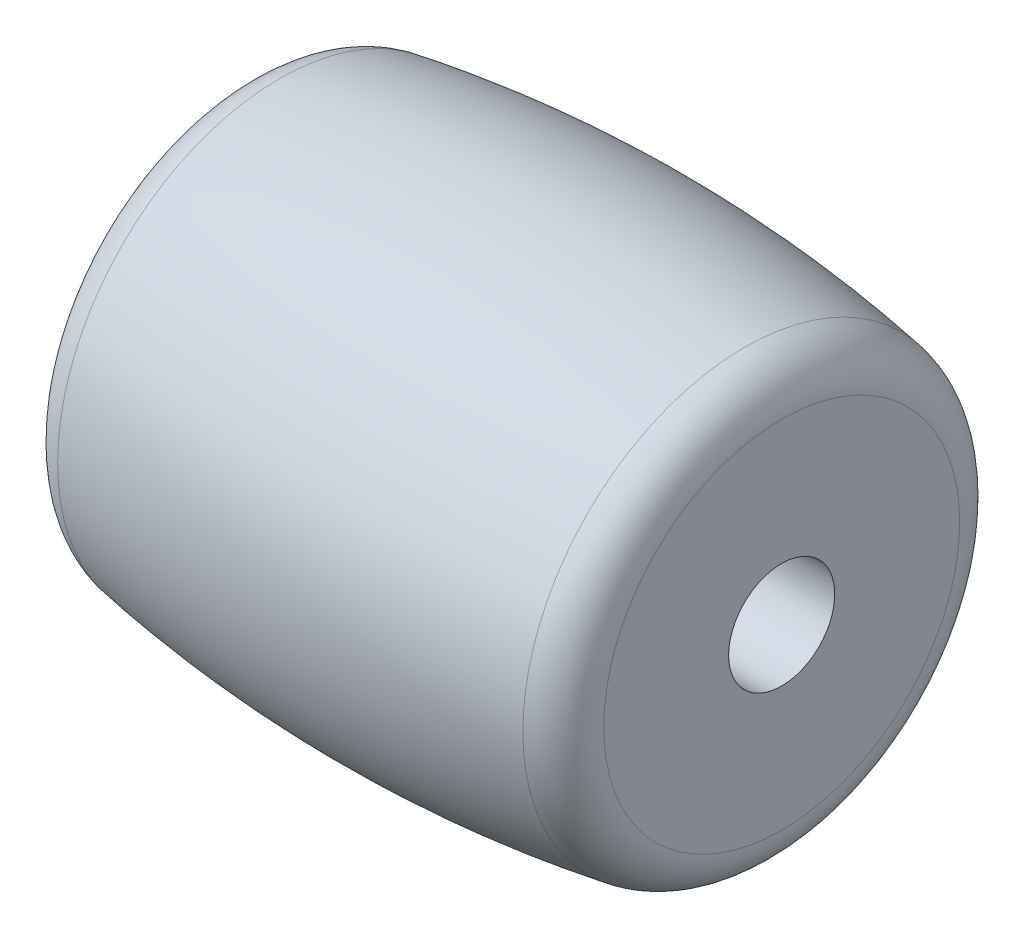
ISO-10303-21;
HEADER;
FILE_DESCRIPTION(('STEP AP214'),'2;1');
FILE_NAME('part.step','',(''),(''),'','','');
FILE_SCHEMA(('AUTOMOTIVE_DESIGN { 1 0 10303 214 1 1 1 1 }'));
ENDSEC;
DATA;
#1=APPLICATION_CONTEXT('core data for automotive mechanical design processes');
#2=APPLICATION_PROTOCOL_DEFINITION('international standard','automotive_design',2000,#1);
#3=PRODUCT_CONTEXT('',#1,'mechanical');
#4=PRODUCT('Part','Part','',(#3));
#5=PRODUCT_RELATED_PRODUCT_CATEGORY('part','',(#4));
#6=PRODUCT_DEFINITION_FORMATION('','',#4);
#7=PRODUCT_DEFINITION_CONTEXT('part definition',#1,'design');
#8=PRODUCT_DEFINITION('design','',#6,#7);
#9=PRODUCT_DEFINITION_SHAPE('','',#8);
#10=(LENGTH_UNIT() NAMED_UNIT(*) SI_UNIT(.MILLI.,.METRE.));
#11=(NAMED_UNIT(*) PLANE_ANGLE_UNIT() SI_UNIT($,.RADIAN.));
#12=(NAMED_UNIT(*) SI_UNIT($,.STERADIAN.) SOLID_ANGLE_UNIT());
#13=UNCERTAINTY_MEASURE_WITH_UNIT(LENGTH_MEASURE(1.E-05),#10,'distance_accuracy_value','');
#14=(GEOMETRIC_REPRESENTATION_CONTEXT(3) GLOBAL_UNCERTAINTY_ASSIGNED_CONTEXT((#13)) GLOBAL_UNIT_ASSIGNED_CONTEXT((#10,
#11,#12)) REPRESENTATION_CONTEXT('',''));
#15=CARTESIAN_POINT('',(0.,0.,0.));
#16=DIRECTION('',(0.,0.,1.));
#17=DIRECTION('',(1.,0.,0.));
#18=AXIS2_PLACEMENT_3D('',#15,#16,#17);
#19=CARTESIAN_POINT('',(9.65199999999999,0.,0.));
#20=DIRECTION('',(-1.,0.,0.));
#21=DIRECTION('',(0.,0.,1.));
#22=AXIS2_PLACEMENT_3D('',#19,#20,#21);
#23=CYLINDRICAL_SURFACE('',#22,1.9);
#24=CARTESIAN_POINT('',(9.65199999999999,0.,0.));
#25=DIRECTION('',(-1.,0.,0.));
#26=DIRECTION('',(0.,0.,1.));
#27=AXIS2_PLACEMENT_3D('',#24,#25,#26);
#28=CIRCLE('',#27,1.9);
#29=CARTESIAN_POINT('',(9.65199999999999,0.,1.9));
#30=VERTEX_POINT('',#29);
#31=EDGE_CURVE('E53',#30,#30,#28,.F.);
#32=ORIENTED_EDGE('',*,*,#31,.T.);
#33=EDGE_LOOP('',(#32));
#34=FACE_BOUND('',#33,.T.);
#35=CARTESIAN_POINT('',(-9.65199999999999,0.,0.));
#36=DIRECTION('',(-1.,0.,0.));
#37=DIRECTION('',(0.,0.,1.));
#38=AXIS2_PLACEMENT_3D('',#35,#36,#37);
#39=CIRCLE('',#38,1.9);
#40=CARTESIAN_POINT('',(-9.65199999999999,0.,1.9));
#41=VERTEX_POINT('',#40);
#42=EDGE_CURVE('E52',#41,#41,#39,.T.);
#43=ORIENTED_EDGE('',*,*,#42,.T.);
#44=EDGE_LOOP('',(#43));
#45=FACE_BOUND('',#44,.T.);
#46=ADVANCED_FACE('F16',(#34,#45),#23,.F.);
#47=CARTESIAN_POINT('',(9.65199999999999,7.6962,0.));
#48=DIRECTION('',(-1.,0.,0.));
#49=DIRECTION('',(0.,-1.,0.));
#50=AXIS2_PLACEMENT_3D('',#47,#48,#49);
#51=PLANE('',#50);
#52=CARTESIAN_POINT('',(9.65199999999999,0.,0.));
#53=DIRECTION('',(-1.,0.,0.));
#54=DIRECTION('',(0.,-1.,0.));
#55=AXIS2_PLACEMENT_3D('',#52,#53,#54);
#56=CIRCLE('',#55,6.36880290141238);
#57=CARTESIAN_POINT('',(9.65199999999999,-6.36880290141238,0.));
#58=VERTEX_POINT('',#57);
#59=CARTESIAN_POINT('',(9.65199999999999,6.36880290141238,0.));
#60=VERTEX_POINT('',#59);
#61=EDGE_CURVE('E44',#58,#60,#56,.T.);
#62=ORIENTED_EDGE('',*,*,#61,.F.);
#63=CARTESIAN_POINT('',(9.65199999999999,0.,0.));
#64=DIRECTION('',(-1.,0.,0.));
#65=DIRECTION('',(0.,1.,0.));
#66=AXIS2_PLACEMENT_3D('',#63,#64,#65);
#67=CIRCLE('',#66,6.36880290141238);
#68=EDGE_CURVE('E50',#60,#58,#67,.T.);
#69=ORIENTED_EDGE('',*,*,#68,.F.);
#70=EDGE_LOOP('',(#62,#69));
#71=FACE_BOUND('',#70,.T.);
#72=ORIENTED_EDGE('',*,*,#31,.F.);
#73=EDGE_LOOP('',(#72));
#74=FACE_BOUND('',#73,.T.);
#75=ADVANCED_FACE('F48',(#71,#74),#51,.F.);
#76=CARTESIAN_POINT('',(-9.65199999999999,7.6962,0.));
#77=DIRECTION('',(1.,0.,0.));
#78=DIRECTION('',(0.,1.,0.));
#79=AXIS2_PLACEMENT_3D('',#76,#77,#78);
#80=PLANE('',#79);
#81=CARTESIAN_POINT('',(-9.65199999999999,0.,0.));
#82=DIRECTION('',(1.,0.,0.));
#83=DIRECTION('',(0.,1.,0.));
#84=AXIS2_PLACEMENT_3D('',#81,#82,#83);
#85=CIRCLE('',#84,6.36880290141238);
#86=CARTESIAN_POINT('',(-9.65199999999999,6.36880290141238,0.));
#87=VERTEX_POINT('',#86);
#88=CARTESIAN_POINT('',(-9.65199999999999,-6.36880290141238,0.));
#89=VERTEX_POINT('',#88);
#90=EDGE_CURVE('E35',#87,#89,#85,.T.);
#91=ORIENTED_EDGE('',*,*,#90,.F.);
#92=CARTESIAN_POINT('',(-9.65199999999999,0.,0.));
#93=DIRECTION('',(1.,0.,0.));
#94=DIRECTION('',(0.,-1.,0.));
#95=AXIS2_PLACEMENT_3D('',#92,#93,#94);
#96=CIRCLE('',#95,6.36880290141238);
#97=EDGE_CURVE('E58',#89,#87,#96,.T.);
#98=ORIENTED_EDGE('',*,*,#97,.F.);
#99=EDGE_LOOP('',(#91,#98));
#100=FACE_BOUND('',#99,.T.);
#101=ORIENTED_EDGE('',*,*,#42,.F.);
#102=EDGE_LOOP('',(#101));
#103=FACE_BOUND('',#102,.T.);
#104=ADVANCED_FACE('F78',(#100,#103),#80,.F.);
#105=CARTESIAN_POINT('',(8.06449999999999,0.,0.));
#106=DIRECTION('',(-1.,0.,0.));
#107=DIRECTION('',(0.,-1.,0.));
#108=AXIS2_PLACEMENT_3D('',#105,#106,#107);
#109=TOROIDAL_SURFACE('',#108,6.36880290141238,1.5875);
#110=ORIENTED_EDGE('',*,*,#61,.T.);
#111=ORIENTED_EDGE('',*,*,#68,.T.);
#112=EDGE_LOOP('',(#110,#111));
#113=FACE_BOUND('',#112,.T.);
#114=CARTESIAN_POINT('',(8.32464516129031,0.,0.));
#115=DIRECTION('',(-1.,0.,0.));
#116=DIRECTION('',(0.,-1.,0.));
#117=AXIS2_PLACEMENT_3D('',#114,#115,#116);
#118=CIRCLE('',#117,7.9348427301068);
#119=CARTESIAN_POINT('',(8.32464516129031,-7.9348427301068,0.));
#120=VERTEX_POINT('',#119);
#121=EDGE_CURVE('E27',#120,#120,#118,.T.);
#122=ORIENTED_EDGE('',*,*,#121,.F.);
#123=EDGE_LOOP('',(#122));
#124=FACE_BOUND('',#123,.T.);
#125=ADVANCED_FACE('F56',(#113,#124),#109,.T.);
#126=CARTESIAN_POINT('',(-8.06449999999999,0.,0.));
#127=DIRECTION('',(1.,0.,0.));
#128=DIRECTION('',(0.,1.,0.));
#129=AXIS2_PLACEMENT_3D('',#126,#127,#128);
#130=TOROIDAL_SURFACE('',#129,6.36880290141238,1.5875);
#131=ORIENTED_EDGE('',*,*,#90,.T.);
#132=ORIENTED_EDGE('',*,*,#97,.T.);
#133=EDGE_LOOP('',(#131,#132));
#134=FACE_BOUND('',#133,.T.);
#135=CARTESIAN_POINT('',(-8.32464516129031,0.,0.));
#136=DIRECTION('',(-1.,0.,0.));
#137=DIRECTION('',(0.,-1.,0.));
#138=AXIS2_PLACEMENT_3D('',#135,#136,#137);
#139=CIRCLE('',#138,7.9348427301068);
#140=CARTESIAN_POINT('',(-8.32464516129031,-7.9348427301068,0.));
#141=VERTEX_POINT('',#140);
#142=EDGE_CURVE('E11',#141,#141,#139,.F.);
#143=ORIENTED_EDGE('',*,*,#142,.F.);
#144=EDGE_LOOP('',(#143));
#145=FACE_BOUND('',#144,.T.);
#146=ADVANCED_FACE('F77',(#134,#145),#130,.T.);
#147=CARTESIAN_POINT('',(0.,42.1784317881145,0.));
#148=DIRECTION('',(0.,0.,1.));
#149=DIRECTION('',(0.,-1.,0.));
#150=AXIS2_PLACEMENT_3D('',#147,#148,#149);
#151=CIRCLE('',#150,50.8);
#152=TRIMMED_CURVE('',#151,(PARAMETER_VALUE(-0.591179110826644)),
(PARAMETER_VALUE(0.591179110826644)),.T.,.PARAMETER.);
#153=CARTESIAN_POINT('',(0.,0.,0.));
#154=DIRECTION('',(-1.,0.,0.));
#155=AXIS1_PLACEMENT('',#153,#154);
#156=SURFACE_OF_REVOLUTION('',#152,#155);
#157=ORIENTED_EDGE('',*,*,#121,.T.);
#158=EDGE_LOOP('',(#157));
#159=FACE_BOUND('',#158,.T.);
#160=ORIENTED_EDGE('',*,*,#142,.T.);
#161=EDGE_LOOP('',(#160));
#162=FACE_BOUND('',#161,.T.);
#163=ADVANCED_FACE('F119',(#159,#162),#156,.F.);
#164=CLOSED_SHELL('',(#46,#75,#104,#125,#146,#163));
#165=MANIFOLD_SOLID_BREP('B1',#164);
#166=ADVANCED_BREP_SHAPE_REPRESENTATION('',(#18,#165),#14);
#167=SHAPE_DEFINITION_REPRESENTATION(#9,#166);
ENDSEC;
END-ISO-10303-21;
